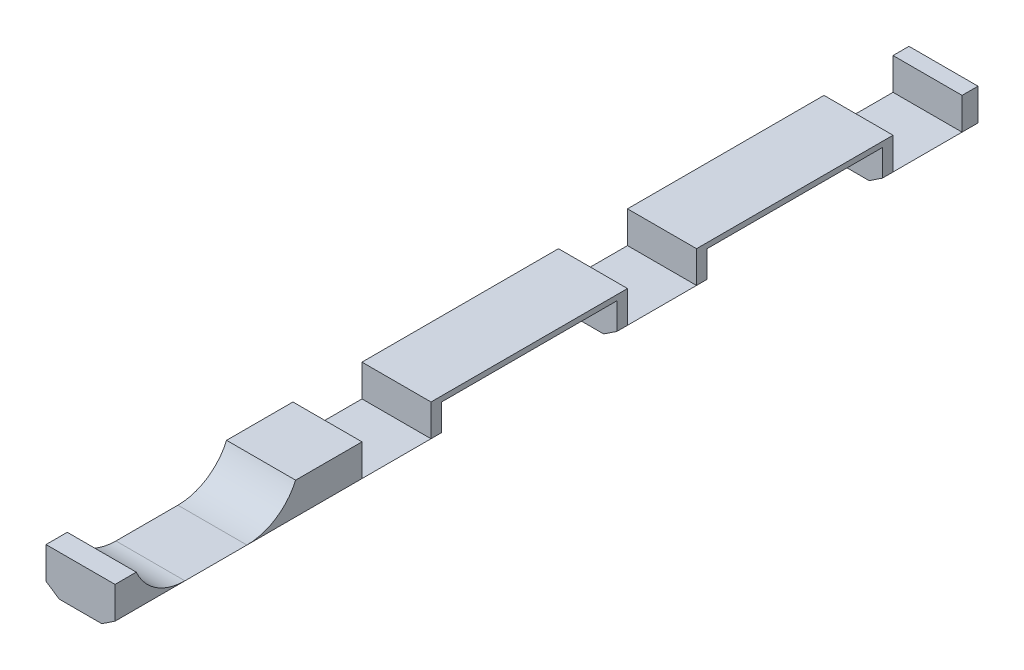
ISO-10303-21;
HEADER;
FILE_DESCRIPTION(('STEP AP214'),'2;1');
FILE_NAME('part.step','',(''),(''),'','','');
FILE_SCHEMA(('AUTOMOTIVE_DESIGN { 1 0 10303 214 1 1 1 1 }'));
ENDSEC;
DATA;
#1=APPLICATION_CONTEXT('core data for automotive mechanical design processes');
#2=APPLICATION_PROTOCOL_DEFINITION('international standard','automotive_design',2000,#1);
#3=PRODUCT_CONTEXT('',#1,'mechanical');
#4=PRODUCT('Part','Part','',(#3));
#5=PRODUCT_RELATED_PRODUCT_CATEGORY('part','',(#4));
#6=PRODUCT_DEFINITION_FORMATION('','',#4);
#7=PRODUCT_DEFINITION_CONTEXT('part definition',#1,'design');
#8=PRODUCT_DEFINITION('design','',#6,#7);
#9=PRODUCT_DEFINITION_SHAPE('','',#8);
#10=(LENGTH_UNIT() NAMED_UNIT(*) SI_UNIT(.MILLI.,.METRE.));
#11=(NAMED_UNIT(*) PLANE_ANGLE_UNIT() SI_UNIT($,.RADIAN.));
#12=(NAMED_UNIT(*) SI_UNIT($,.STERADIAN.) SOLID_ANGLE_UNIT());
#13=UNCERTAINTY_MEASURE_WITH_UNIT(LENGTH_MEASURE(1.E-05),#10,'distance_accuracy_value','');
#14=(GEOMETRIC_REPRESENTATION_CONTEXT(3) GLOBAL_UNCERTAINTY_ASSIGNED_CONTEXT((#13)) GLOBAL_UNIT_ASSIGNED_CONTEXT((#10,
#11,#12)) REPRESENTATION_CONTEXT('',''));
#15=CARTESIAN_POINT('',(0.,0.,0.));
#16=DIRECTION('',(0.,0.,1.));
#17=DIRECTION('',(1.,0.,0.));
#18=AXIS2_PLACEMENT_3D('',#15,#16,#17);
#19=CARTESIAN_POINT('',(-1.,0.663324958071081,65.));
#20=DIRECTION('',(0.552770798392567,0.833333333333333,0.));
#21=DIRECTION('',(-0.833333333333333,0.552770798392567,0.));
#22=AXIS2_PLACEMENT_3D('',#19,#20,#21);
#23=PLANE('',#22);
#24=DIRECTION('',(0.,0.,-1.));
#25=VECTOR('',#24,1.);
#26=CARTESIAN_POINT('',(0.,0.,65.));
#27=LINE('',#26,#25);
#28=CARTESIAN_POINT('',(0.,0.,27.2));
#29=VERTEX_POINT('',#28);
#30=CARTESIAN_POINT('',(0.,0.,20.4));
#31=VERTEX_POINT('',#30);
#32=EDGE_CURVE('E487',#29,#31,#27,.T.);
#33=ORIENTED_EDGE('',*,*,#32,.F.);
#34=DIRECTION('',(-0.833333333333333,0.552770798392567,0.));
#35=VECTOR('',#34,1.);
#36=CARTESIAN_POINT('',(-0.999999999999995,0.663324958071077,27.2));
#37=LINE('',#36,#35);
#38=CARTESIAN_POINT('',(-1.,0.663324958071081,27.2));
#39=VERTEX_POINT('',#38);
#40=EDGE_CURVE('E293',#29,#39,#37,.T.);
#41=ORIENTED_EDGE('',*,*,#40,.T.);
#42=DIRECTION('',(0.,0.,-1.));
#43=VECTOR('',#42,1.);
#44=CARTESIAN_POINT('',(-1.,0.663324958071081,65.));
#45=LINE('',#44,#43);
#46=CARTESIAN_POINT('',(-1.,0.663324958071081,26.4));
#47=VERTEX_POINT('',#46);
#48=EDGE_CURVE('E462',#39,#47,#45,.T.);
#49=ORIENTED_EDGE('',*,*,#48,.T.);
#50=DIRECTION('',(0.,0.,1.));
#51=VECTOR('',#50,1.);
#52=CARTESIAN_POINT('',(-1.,0.663324958071081,21.2));
#53=LINE('',#52,#51);
#54=CARTESIAN_POINT('',(-1.,0.663324958071081,21.2));
#55=VERTEX_POINT('',#54);
#56=EDGE_CURVE('E346',#55,#47,#53,.T.);
#57=ORIENTED_EDGE('',*,*,#56,.F.);
#58=CARTESIAN_POINT('',(-1.,0.663324958071081,20.4));
#59=VERTEX_POINT('',#58);
#60=EDGE_CURVE('E658',#55,#59,#45,.T.);
#61=ORIENTED_EDGE('',*,*,#60,.T.);
#62=DIRECTION('',(0.833333333333333,-0.552770798392567,0.));
#63=VECTOR('',#62,1.);
#64=CARTESIAN_POINT('',(-1.,0.663324958071081,20.4));
#65=LINE('',#64,#63);
#66=EDGE_CURVE('E315',#59,#31,#65,.T.);
#67=ORIENTED_EDGE('',*,*,#66,.T.);
#68=EDGE_LOOP('',(#33,#41,#49,#57,#61,#67));
#69=FACE_BOUND('',#68,.T.);
#70=ADVANCED_FACE('F35',(#69),#23,.F.);
#71=CARTESIAN_POINT('',(0.,0.,65.));
#72=DIRECTION('',(0.,1.,0.));
#73=DIRECTION('',(0.,0.,1.));
#74=AXIS2_PLACEMENT_3D('',#71,#72,#73);
#75=PLANE('',#74);
#76=DIRECTION('',(0.,0.,-1.));
#77=VECTOR('',#76,1.);
#78=CARTESIAN_POINT('',(3.2,0.,65.));
#79=LINE('',#78,#77);
#80=CARTESIAN_POINT('',(3.2,0.,27.2));
#81=VERTEX_POINT('',#80);
#82=CARTESIAN_POINT('',(3.2,0.,20.4));
#83=VERTEX_POINT('',#82);
#84=EDGE_CURVE('E482',#81,#83,#79,.T.);
#85=ORIENTED_EDGE('',*,*,#84,.F.);
#86=DIRECTION('',(-1.,0.,0.));
#87=VECTOR('',#86,1.);
#88=CARTESIAN_POINT('',(0.,0.,27.2));
#89=LINE('',#88,#87);
#90=EDGE_CURVE('E290',#81,#29,#89,.T.);
#91=ORIENTED_EDGE('',*,*,#90,.T.);
#92=ORIENTED_EDGE('',*,*,#32,.T.);
#93=DIRECTION('',(1.,0.,0.));
#94=VECTOR('',#93,1.);
#95=CARTESIAN_POINT('',(0.,0.,20.4));
#96=LINE('',#95,#94);
#97=EDGE_CURVE('E311',#31,#83,#96,.T.);
#98=ORIENTED_EDGE('',*,*,#97,.T.);
#99=EDGE_LOOP('',(#85,#91,#92,#98));
#100=FACE_BOUND('',#99,.T.);
#101=ADVANCED_FACE('F590',(#100),#75,.F.);
#102=CARTESIAN_POINT('',(3.2,0.,65.));
#103=DIRECTION('',(-0.552770798392567,0.833333333333333,0.));
#104=DIRECTION('',(-0.833333333333333,-0.552770798392567,0.));
#105=AXIS2_PLACEMENT_3D('',#102,#103,#104);
#106=PLANE('',#105);
#107=DIRECTION('',(0.,0.,-1.));
#108=VECTOR('',#107,1.);
#109=CARTESIAN_POINT('',(4.2,0.66332495807108,65.));
#110=LINE('',#109,#108);
#111=CARTESIAN_POINT('',(4.2,0.663324958071079,27.2));
#112=VERTEX_POINT('',#111);
#113=CARTESIAN_POINT('',(4.2,0.663324958071081,26.4));
#114=VERTEX_POINT('',#113);
#115=EDGE_CURVE('E477',#112,#114,#110,.T.);
#116=ORIENTED_EDGE('',*,*,#115,.F.);
#117=DIRECTION('',(-0.833333333333333,-0.552770798392567,0.));
#118=VECTOR('',#117,1.);
#119=CARTESIAN_POINT('',(3.2,0.,27.2));
#120=LINE('',#119,#118);
#121=EDGE_CURVE('E11',#112,#81,#120,.T.);
#122=ORIENTED_EDGE('',*,*,#121,.T.);
#123=ORIENTED_EDGE('',*,*,#84,.T.);
#124=DIRECTION('',(0.833333333333333,0.552770798392567,0.));
#125=VECTOR('',#124,1.);
#126=CARTESIAN_POINT('',(3.2,0.,20.4));
#127=LINE('',#126,#125);
#128=CARTESIAN_POINT('',(4.2,0.66332495807108,20.4));
#129=VERTEX_POINT('',#128);
#130=EDGE_CURVE('E503',#83,#129,#127,.T.);
#131=ORIENTED_EDGE('',*,*,#130,.T.);
#132=CARTESIAN_POINT('',(4.2,0.663324958071081,21.2));
#133=VERTEX_POINT('',#132);
#134=EDGE_CURVE('E517',#133,#129,#110,.T.);
#135=ORIENTED_EDGE('',*,*,#134,.F.);
#136=DIRECTION('',(0.,0.,1.));
#137=VECTOR('',#136,1.);
#138=CARTESIAN_POINT('',(4.2,0.663324958071081,65.));
#139=LINE('',#138,#137);
#140=EDGE_CURVE('E389',#133,#114,#139,.T.);
#141=ORIENTED_EDGE('',*,*,#140,.T.);
#142=EDGE_LOOP('',(#116,#122,#123,#131,#135,#141));
#143=FACE_BOUND('',#142,.T.);
#144=ADVANCED_FACE('F585',(#143),#106,.F.);
#145=CARTESIAN_POINT('',(0.,0.,7.19999999999999));
#146=VERTEX_POINT('',#145);
#147=CARTESIAN_POINT('',(0.,0.,0.));
#148=VERTEX_POINT('',#147);
#149=EDGE_CURVE('E481',#146,#148,#27,.T.);
#150=ORIENTED_EDGE('',*,*,#149,.F.);
#151=DIRECTION('',(-0.833333333333333,0.552770798392567,0.));
#152=VECTOR('',#151,1.);
#153=CARTESIAN_POINT('',(-0.999999999999992,0.663324958071076,7.19999999999999));
#154=LINE('',#153,#152);
#155=CARTESIAN_POINT('',(-1.,0.663324958071081,7.19999999999999));
#156=VERTEX_POINT('',#155);
#157=EDGE_CURVE('E322',#146,#156,#154,.T.);
#158=ORIENTED_EDGE('',*,*,#157,.T.);
#159=CARTESIAN_POINT('',(-1.,0.663324958071081,6.39999999999999));
#160=VERTEX_POINT('',#159);
#161=EDGE_CURVE('E604',#156,#160,#45,.T.);
#162=ORIENTED_EDGE('',*,*,#161,.T.);
#163=DIRECTION('',(0.,0.,1.));
#164=VECTOR('',#163,1.);
#165=CARTESIAN_POINT('',(-1.,0.663324958071081,1.2));
#166=LINE('',#165,#164);
#167=CARTESIAN_POINT('',(-1.,0.663324958071081,1.20000000000001));
#168=VERTEX_POINT('',#167);
#169=EDGE_CURVE('E400',#168,#160,#166,.T.);
#170=ORIENTED_EDGE('',*,*,#169,.F.);
#171=CARTESIAN_POINT('',(-1.,0.663324958071081,0.));
#172=VERTEX_POINT('',#171);
#173=EDGE_CURVE('E441',#168,#172,#45,.T.);
#174=ORIENTED_EDGE('',*,*,#173,.T.);
#175=DIRECTION('',(0.833333333333333,-0.552770798392567,0.));
#176=VECTOR('',#175,1.);
#177=CARTESIAN_POINT('',(-1.,0.663324958071081,0.));
#178=LINE('',#177,#176);
#179=EDGE_CURVE('E426',#172,#148,#178,.T.);
#180=ORIENTED_EDGE('',*,*,#179,.T.);
#181=EDGE_LOOP('',(#150,#158,#162,#170,#174,#180));
#182=FACE_BOUND('',#181,.T.);
#183=ADVANCED_FACE('F602',(#182),#23,.F.);
#184=CARTESIAN_POINT('',(3.2,0.,7.19999999999999));
#185=VERTEX_POINT('',#184);
#186=CARTESIAN_POINT('',(3.2,0.,0.));
#187=VERTEX_POINT('',#186);
#188=EDGE_CURVE('E475',#185,#187,#79,.T.);
#189=ORIENTED_EDGE('',*,*,#188,.F.);
#190=DIRECTION('',(-1.,0.,0.));
#191=VECTOR('',#190,1.);
#192=CARTESIAN_POINT('',(0.,0.,7.19999999999999));
#193=LINE('',#192,#191);
#194=EDGE_CURVE('E319',#185,#146,#193,.T.);
#195=ORIENTED_EDGE('',*,*,#194,.T.);
#196=ORIENTED_EDGE('',*,*,#149,.T.);
#197=DIRECTION('',(1.,0.,0.));
#198=VECTOR('',#197,1.);
#199=CARTESIAN_POINT('',(0.,0.,0.));
#200=LINE('',#199,#198);
#201=EDGE_CURVE('E444',#148,#187,#200,.T.);
#202=ORIENTED_EDGE('',*,*,#201,.T.);
#203=EDGE_LOOP('',(#189,#195,#196,#202));
#204=FACE_BOUND('',#203,.T.);
#205=ADVANCED_FACE('F597',(#204),#75,.F.);
#206=CARTESIAN_POINT('',(4.2,0.66332495807108,7.19999999999999));
#207=VERTEX_POINT('',#206);
#208=CARTESIAN_POINT('',(4.2,0.663324958071081,6.39999999999999));
#209=VERTEX_POINT('',#208);
#210=EDGE_CURVE('E518',#207,#209,#110,.T.);
#211=ORIENTED_EDGE('',*,*,#210,.F.);
#212=DIRECTION('',(-0.833333333333333,-0.552770798392567,0.));
#213=VECTOR('',#212,1.);
#214=CARTESIAN_POINT('',(3.19999999999999,0.,7.19999999999999));
#215=LINE('',#214,#213);
#216=EDGE_CURVE('E505',#207,#185,#215,.T.);
#217=ORIENTED_EDGE('',*,*,#216,.T.);
#218=ORIENTED_EDGE('',*,*,#188,.T.);
#219=DIRECTION('',(0.833333333333333,0.552770798392567,0.));
#220=VECTOR('',#219,1.);
#221=CARTESIAN_POINT('',(3.2,0.,0.));
#222=LINE('',#221,#220);
#223=CARTESIAN_POINT('',(4.2,0.66332495807108,0.));
#224=VERTEX_POINT('',#223);
#225=EDGE_CURVE('E447',#187,#224,#222,.T.);
#226=ORIENTED_EDGE('',*,*,#225,.T.);
#227=CARTESIAN_POINT('',(4.2,0.663324958071081,1.2));
#228=VERTEX_POINT('',#227);
#229=EDGE_CURVE('E471',#228,#224,#110,.T.);
#230=ORIENTED_EDGE('',*,*,#229,.F.);
#231=DIRECTION('',(0.,0.,1.));
#232=VECTOR('',#231,1.);
#233=CARTESIAN_POINT('',(4.2,0.663324958071081,65.));
#234=LINE('',#233,#232);
#235=EDGE_CURVE('E409',#228,#209,#234,.T.);
#236=ORIENTED_EDGE('',*,*,#235,.T.);
#237=EDGE_LOOP('',(#211,#217,#218,#226,#230,#236));
#238=FACE_BOUND('',#237,.T.);
#239=ADVANCED_FACE('F537',(#238),#106,.F.);
#240=CARTESIAN_POINT('',(4.2,0.66332495807108,65.));
#241=DIRECTION('',(-1.,0.,0.));
#242=DIRECTION('',(0.,0.,1.));
#243=AXIS2_PLACEMENT_3D('',#240,#241,#242);
#244=PLANE('',#243);
#245=CARTESIAN_POINT('',(4.2,0.66332495807108,65.));
#246=VERTEX_POINT('',#245);
#247=CARTESIAN_POINT('',(4.2,0.66332495807108,59.7339394440353));
#248=VERTEX_POINT('',#247);
#249=EDGE_CURVE('E473',#246,#248,#110,.T.);
#250=ORIENTED_EDGE('',*,*,#249,.T.);
#251=CARTESIAN_POINT('',(4.2,4.66332495807108,59.7339394440353));
#252=DIRECTION('',(-1.,0.,0.));
#253=DIRECTION('',(0.,0.,1.));
#254=AXIS2_PLACEMENT_3D('',#251,#252,#253);
#255=CIRCLE('',#254,4.);
#256=CARTESIAN_POINT('',(4.2,3.06332495807108,63.4));
#257=VERTEX_POINT('',#256);
#258=EDGE_CURVE('E501',#248,#257,#255,.T.);
#259=ORIENTED_EDGE('',*,*,#258,.T.);
#260=DIRECTION('',(0.,0.,-1.));
#261=VECTOR('',#260,1.);
#262=CARTESIAN_POINT('',(4.2,3.06332495807108,65.));
#263=LINE('',#262,#261);
#264=CARTESIAN_POINT('',(4.2,3.06332495807108,65.));
#265=VERTEX_POINT('',#264);
#266=EDGE_CURVE('E468',#265,#257,#263,.T.);
#267=ORIENTED_EDGE('',*,*,#266,.F.);
#268=DIRECTION('',(0.,1.,0.));
#269=VECTOR('',#268,1.);
#270=CARTESIAN_POINT('',(4.2,0.66332495807108,65.));
#271=LINE('',#270,#269);
#272=EDGE_CURVE('E435',#246,#265,#271,.T.);
#273=ORIENTED_EDGE('',*,*,#272,.F.);
#274=EDGE_LOOP('',(#250,#259,#267,#273));
#275=FACE_BOUND('',#274,.T.);
#276=ADVANCED_FACE('F644',(#275),#244,.F.);
#277=CARTESIAN_POINT('',(4.2,3.06332495807108,65.));
#278=DIRECTION('',(0.,-1.,0.));
#279=DIRECTION('',(0.,0.,-1.));
#280=AXIS2_PLACEMENT_3D('',#277,#278,#279);
#281=PLANE('',#280);
#282=ORIENTED_EDGE('',*,*,#266,.T.);
#283=DIRECTION('',(-1.,0.,0.));
#284=VECTOR('',#283,1.);
#285=CARTESIAN_POINT('',(5.,3.06332495807108,63.4));
#286=LINE('',#285,#284);
#287=CARTESIAN_POINT('',(-1.,3.06332495807108,63.4));
#288=VERTEX_POINT('',#287);
#289=EDGE_CURVE('E335',#257,#288,#286,.T.);
#290=ORIENTED_EDGE('',*,*,#289,.T.);
#291=DIRECTION('',(0.,0.,-1.));
#292=VECTOR('',#291,1.);
#293=CARTESIAN_POINT('',(-1.,3.06332495807108,65.));
#294=LINE('',#293,#292);
#295=CARTESIAN_POINT('',(-1.,3.06332495807108,65.));
#296=VERTEX_POINT('',#295);
#297=EDGE_CURVE('E463',#296,#288,#294,.T.);
#298=ORIENTED_EDGE('',*,*,#297,.F.);
#299=DIRECTION('',(-1.,0.,0.));
#300=VECTOR('',#299,1.);
#301=CARTESIAN_POINT('',(4.2,3.06332495807108,65.));
#302=LINE('',#301,#300);
#303=EDGE_CURVE('E437',#265,#296,#302,.T.);
#304=ORIENTED_EDGE('',*,*,#303,.F.);
#305=EDGE_LOOP('',(#282,#290,#298,#304));
#306=FACE_BOUND('',#305,.T.);
#307=ADVANCED_FACE('F788',(#306),#281,.F.);
#308=CARTESIAN_POINT('',(-1.,3.06332495807108,65.));
#309=DIRECTION('',(1.,0.,0.));
#310=DIRECTION('',(0.,1.,0.));
#311=AXIS2_PLACEMENT_3D('',#308,#309,#310);
#312=PLANE('',#311);
#313=ORIENTED_EDGE('',*,*,#297,.T.);
#314=CARTESIAN_POINT('',(-1.,4.66332495807108,59.7339394440353));
#315=DIRECTION('',(1.,0.,0.));
#316=DIRECTION('',(0.,1.,0.));
#317=AXIS2_PLACEMENT_3D('',#314,#315,#316);
#318=CIRCLE('',#317,4.);
#319=CARTESIAN_POINT('',(-1.,0.663324958071082,59.7339394440353));
#320=VERTEX_POINT('',#319);
#321=EDGE_CURVE('E498',#288,#320,#318,.T.);
#322=ORIENTED_EDGE('',*,*,#321,.T.);
#323=CARTESIAN_POINT('',(-1.,0.663324958071081,65.));
#324=VERTEX_POINT('',#323);
#325=EDGE_CURVE('E458',#324,#320,#45,.T.);
#326=ORIENTED_EDGE('',*,*,#325,.F.);
#327=DIRECTION('',(0.,-1.,0.));
#328=VECTOR('',#327,1.);
#329=CARTESIAN_POINT('',(-1.,3.06332495807108,65.));
#330=LINE('',#329,#328);
#331=EDGE_CURVE('E439',#296,#324,#330,.T.);
#332=ORIENTED_EDGE('',*,*,#331,.F.);
#333=EDGE_LOOP('',(#313,#322,#326,#332));
#334=FACE_BOUND('',#333,.T.);
#335=ADVANCED_FACE('F623',(#334),#312,.F.);
#336=DIRECTION('',(0.,0.,-1.));
#337=VECTOR('',#336,1.);
#338=CARTESIAN_POINT('',(4.2,2.66332495807108,65.));
#339=LINE('',#338,#337);
#340=CARTESIAN_POINT('',(4.2,2.66332495807108,20.4));
#341=VERTEX_POINT('',#340);
#342=CARTESIAN_POINT('',(4.2,2.66332495807108,7.19999999999999));
#343=VERTEX_POINT('',#342);
#344=EDGE_CURVE('E328',#341,#343,#339,.T.);
#345=ORIENTED_EDGE('',*,*,#344,.T.);
#346=DIRECTION('',(0.,-1.,0.));
#347=VECTOR('',#346,1.);
#348=CARTESIAN_POINT('',(4.2,0.663324958071064,7.19999999999999));
#349=LINE('',#348,#347);
#350=EDGE_CURVE('E325',#343,#207,#349,.T.);
#351=ORIENTED_EDGE('',*,*,#350,.T.);
#352=ORIENTED_EDGE('',*,*,#210,.T.);
#353=DIRECTION('',(0.,1.,0.));
#354=VECTOR('',#353,1.);
#355=CARTESIAN_POINT('',(4.2,0.66332495807108,6.39999999999999));
#356=LINE('',#355,#354);
#357=CARTESIAN_POINT('',(4.2,3.06332495807108,6.39999999999999));
#358=VERTEX_POINT('',#357);
#359=EDGE_CURVE('E420',#209,#358,#356,.T.);
#360=ORIENTED_EDGE('',*,*,#359,.T.);
#361=CARTESIAN_POINT('',(4.2,3.06332495807108,21.2));
#362=VERTEX_POINT('',#361);
#363=EDGE_CURVE('E575',#362,#358,#263,.T.);
#364=ORIENTED_EDGE('',*,*,#363,.F.);
#365=DIRECTION('',(0.,-1.,0.));
#366=VECTOR('',#365,1.);
#367=CARTESIAN_POINT('',(4.2,0.663324958070949,21.2));
#368=LINE('',#367,#366);
#369=EDGE_CURVE('E395',#362,#133,#368,.T.);
#370=ORIENTED_EDGE('',*,*,#369,.T.);
#371=ORIENTED_EDGE('',*,*,#134,.T.);
#372=DIRECTION('',(0.,1.,0.));
#373=VECTOR('',#372,1.);
#374=CARTESIAN_POINT('',(4.2,0.66332495807108,20.4));
#375=LINE('',#374,#373);
#376=EDGE_CURVE('E58',#129,#341,#375,.T.);
#377=ORIENTED_EDGE('',*,*,#376,.T.);
#378=EDGE_LOOP('',(#345,#351,#352,#360,#364,#370,#371,#377));
#379=FACE_BOUND('',#378,.T.);
#380=ADVANCED_FACE('F524',(#379),#244,.F.);
#381=DIRECTION('',(0.,0.,-1.));
#382=VECTOR('',#381,1.);
#383=CARTESIAN_POINT('',(4.2,2.66332495807108,65.));
#384=LINE('',#383,#382);
#385=CARTESIAN_POINT('',(4.2,2.66332495807108,40.4));
#386=VERTEX_POINT('',#385);
#387=CARTESIAN_POINT('',(4.2,2.66332495807108,27.2));
#388=VERTEX_POINT('',#387);
#389=EDGE_CURVE('E266',#386,#388,#384,.T.);
#390=ORIENTED_EDGE('',*,*,#389,.T.);
#391=DIRECTION('',(0.,-1.,0.));
#392=VECTOR('',#391,1.);
#393=CARTESIAN_POINT('',(4.2,0.663324958071069,27.2));
#394=LINE('',#393,#392);
#395=EDGE_CURVE('E296',#388,#112,#394,.T.);
#396=ORIENTED_EDGE('',*,*,#395,.T.);
#397=ORIENTED_EDGE('',*,*,#115,.T.);
#398=DIRECTION('',(0.,1.,0.));
#399=VECTOR('',#398,1.);
#400=CARTESIAN_POINT('',(4.2,0.66332495807108,26.4));
#401=LINE('',#400,#399);
#402=CARTESIAN_POINT('',(4.2,3.06332495807108,26.4));
#403=VERTEX_POINT('',#402);
#404=EDGE_CURVE('E392',#114,#403,#401,.T.);
#405=ORIENTED_EDGE('',*,*,#404,.T.);
#406=CARTESIAN_POINT('',(4.2,3.06332495807108,41.2));
#407=VERTEX_POINT('',#406);
#408=EDGE_CURVE('E574',#407,#403,#263,.T.);
#409=ORIENTED_EDGE('',*,*,#408,.F.);
#410=DIRECTION('',(0.,-1.,0.));
#411=VECTOR('',#410,1.);
#412=CARTESIAN_POINT('',(4.2,0.663324958071009,41.2));
#413=LINE('',#412,#411);
#414=CARTESIAN_POINT('',(4.2,0.663324958071081,41.2));
#415=VERTEX_POINT('',#414);
#416=EDGE_CURVE('E386',#407,#415,#413,.T.);
#417=ORIENTED_EDGE('',*,*,#416,.T.);
#418=CARTESIAN_POINT('',(4.2,0.66332495807108,40.4));
#419=VERTEX_POINT('',#418);
#420=EDGE_CURVE('E511',#415,#419,#110,.T.);
#421=ORIENTED_EDGE('',*,*,#420,.T.);
#422=DIRECTION('',(0.,1.,0.));
#423=VECTOR('',#422,1.);
#424=CARTESIAN_POINT('',(4.2,0.66332495807108,40.4));
#425=LINE('',#424,#423);
#426=EDGE_CURVE('E50',#419,#386,#425,.T.);
#427=ORIENTED_EDGE('',*,*,#426,.T.);
#428=EDGE_LOOP('',(#390,#396,#397,#405,#409,#417,#421,#427));
#429=FACE_BOUND('',#428,.T.);
#430=ADVANCED_FACE('F515',(#429),#244,.F.);
#431=CARTESIAN_POINT('',(-1.,3.06332495807108,21.2));
#432=VERTEX_POINT('',#431);
#433=CARTESIAN_POINT('',(-1.,3.06332495807108,6.39999999999999));
#434=VERTEX_POINT('',#433);
#435=EDGE_CURVE('E553',#432,#434,#294,.T.);
#436=ORIENTED_EDGE('',*,*,#435,.F.);
#437=DIRECTION('',(-1.,0.,0.));
#438=VECTOR('',#437,1.);
#439=CARTESIAN_POINT('',(5.,3.06332495807108,21.2));
#440=LINE('',#439,#438);
#441=EDGE_CURVE('E353',#362,#432,#440,.T.);
#442=ORIENTED_EDGE('',*,*,#441,.F.);
#443=ORIENTED_EDGE('',*,*,#363,.T.);
#444=DIRECTION('',(-1.,0.,0.));
#445=VECTOR('',#444,1.);
#446=CARTESIAN_POINT('',(5.,3.06332495807108,6.39999999999999));
#447=LINE('',#446,#445);
#448=EDGE_CURVE('E410',#358,#434,#447,.T.);
#449=ORIENTED_EDGE('',*,*,#448,.T.);
#450=EDGE_LOOP('',(#436,#442,#443,#449));
#451=FACE_BOUND('',#450,.T.);
#452=ADVANCED_FACE('F580',(#451),#281,.F.);
#453=ORIENTED_EDGE('',*,*,#408,.T.);
#454=DIRECTION('',(-1.,0.,0.));
#455=VECTOR('',#454,1.);
#456=CARTESIAN_POINT('',(5.,3.06332495807108,26.4));
#457=LINE('',#456,#455);
#458=CARTESIAN_POINT('',(-1.,3.06332495807108,26.4));
#459=VERTEX_POINT('',#458);
#460=EDGE_CURVE('E356',#403,#459,#457,.T.);
#461=ORIENTED_EDGE('',*,*,#460,.T.);
#462=CARTESIAN_POINT('',(-1.,3.06332495807108,41.2));
#463=VERTEX_POINT('',#462);
#464=EDGE_CURVE('E554',#463,#459,#294,.T.);
#465=ORIENTED_EDGE('',*,*,#464,.F.);
#466=DIRECTION('',(-1.,0.,0.));
#467=VECTOR('',#466,1.);
#468=CARTESIAN_POINT('',(5.,3.06332495807108,41.2));
#469=LINE('',#468,#467);
#470=EDGE_CURVE('E347',#407,#463,#469,.T.);
#471=ORIENTED_EDGE('',*,*,#470,.F.);
#472=EDGE_LOOP('',(#453,#461,#465,#471));
#473=FACE_BOUND('',#472,.T.);
#474=ADVANCED_FACE('F619',(#473),#281,.F.);
#475=ORIENTED_EDGE('',*,*,#161,.F.);
#476=DIRECTION('',(0.,-1.,0.));
#477=VECTOR('',#476,1.);
#478=CARTESIAN_POINT('',(-1.,2.66332495807108,7.19999999999999));
#479=LINE('',#478,#477);
#480=CARTESIAN_POINT('',(-1.,2.66332495807108,7.19999999999999));
#481=VERTEX_POINT('',#480);
#482=EDGE_CURVE('E300',#481,#156,#479,.T.);
#483=ORIENTED_EDGE('',*,*,#482,.F.);
#484=DIRECTION('',(0.,0.,-1.));
#485=VECTOR('',#484,1.);
#486=CARTESIAN_POINT('',(-1.,2.66332495807108,7.19999999999999));
#487=LINE('',#486,#485);
#488=CARTESIAN_POINT('',(-1.,2.66332495807108,20.4));
#489=VERTEX_POINT('',#488);
#490=EDGE_CURVE('E305',#489,#481,#487,.T.);
#491=ORIENTED_EDGE('',*,*,#490,.F.);
#492=DIRECTION('',(0.,1.,0.));
#493=VECTOR('',#492,1.);
#494=CARTESIAN_POINT('',(-1.,2.66332495807108,20.4));
#495=LINE('',#494,#493);
#496=EDGE_CURVE('E302',#59,#489,#495,.T.);
#497=ORIENTED_EDGE('',*,*,#496,.F.);
#498=ORIENTED_EDGE('',*,*,#60,.F.);
#499=DIRECTION('',(0.,-1.,0.));
#500=VECTOR('',#499,1.);
#501=CARTESIAN_POINT('',(-1.,3.06332495807108,21.2));
#502=LINE('',#501,#500);
#503=EDGE_CURVE('E344',#432,#55,#502,.T.);
#504=ORIENTED_EDGE('',*,*,#503,.F.);
#505=ORIENTED_EDGE('',*,*,#435,.T.);
#506=DIRECTION('',(0.,1.,0.));
#507=VECTOR('',#506,1.);
#508=CARTESIAN_POINT('',(-1.,3.06332495807108,6.39999999999999));
#509=LINE('',#508,#507);
#510=EDGE_CURVE('E403',#160,#434,#509,.T.);
#511=ORIENTED_EDGE('',*,*,#510,.F.);
#512=EDGE_LOOP('',(#475,#483,#491,#497,#498,#504,#505,#511));
#513=FACE_BOUND('',#512,.T.);
#514=ADVANCED_FACE('F625',(#513),#312,.F.);
#515=ORIENTED_EDGE('',*,*,#48,.F.);
#516=DIRECTION('',(0.,-1.,0.));
#517=VECTOR('',#516,1.);
#518=CARTESIAN_POINT('',(-1.,2.66332495807108,27.2));
#519=LINE('',#518,#517);
#520=CARTESIAN_POINT('',(-1.,2.66332495807108,27.2));
#521=VERTEX_POINT('',#520);
#522=EDGE_CURVE('E277',#521,#39,#519,.T.);
#523=ORIENTED_EDGE('',*,*,#522,.F.);
#524=DIRECTION('',(0.,0.,-1.));
#525=VECTOR('',#524,1.);
#526=CARTESIAN_POINT('',(-1.,2.66332495807108,27.2));
#527=LINE('',#526,#525);
#528=CARTESIAN_POINT('',(-1.,2.66332495807108,40.4));
#529=VERTEX_POINT('',#528);
#530=EDGE_CURVE('E263',#529,#521,#527,.T.);
#531=ORIENTED_EDGE('',*,*,#530,.F.);
#532=DIRECTION('',(0.,1.,0.));
#533=VECTOR('',#532,1.);
#534=CARTESIAN_POINT('',(-1.,2.66332495807108,40.4));
#535=LINE('',#534,#533);
#536=CARTESIAN_POINT('',(-1.,0.663324958071081,40.4));
#537=VERTEX_POINT('',#536);
#538=EDGE_CURVE('E270',#537,#529,#535,.T.);
#539=ORIENTED_EDGE('',*,*,#538,.F.);
#540=CARTESIAN_POINT('',(-1.,0.663324958071081,41.2));
#541=VERTEX_POINT('',#540);
#542=EDGE_CURVE('E605',#541,#537,#45,.T.);
#543=ORIENTED_EDGE('',*,*,#542,.F.);
#544=DIRECTION('',(0.,-1.,0.));
#545=VECTOR('',#544,1.);
#546=CARTESIAN_POINT('',(-1.,3.06332495807108,41.2));
#547=LINE('',#546,#545);
#548=EDGE_CURVE('E343',#463,#541,#547,.T.);
#549=ORIENTED_EDGE('',*,*,#548,.F.);
#550=ORIENTED_EDGE('',*,*,#464,.T.);
#551=DIRECTION('',(0.,1.,0.));
#552=VECTOR('',#551,1.);
#553=CARTESIAN_POINT('',(-1.,3.06332495807108,26.4));
#554=LINE('',#553,#552);
#555=EDGE_CURVE('E350',#47,#459,#554,.T.);
#556=ORIENTED_EDGE('',*,*,#555,.F.);
#557=EDGE_LOOP('',(#515,#523,#531,#539,#543,#549,#550,#556));
#558=FACE_BOUND('',#557,.T.);
#559=ADVANCED_FACE('F280',(#558),#312,.F.);
#560=CARTESIAN_POINT('',(4.2,3.06332495807108,1.19999999999999));
#561=VERTEX_POINT('',#560);
#562=CARTESIAN_POINT('',(4.2,3.06332495807108,0.));
#563=VERTEX_POINT('',#562);
#564=EDGE_CURVE('E466',#561,#563,#263,.T.);
#565=ORIENTED_EDGE('',*,*,#564,.F.);
#566=DIRECTION('',(0.,-1.,0.));
#567=VECTOR('',#566,1.);
#568=CARTESIAN_POINT('',(4.2,0.663324958070889,1.20000000000001));
#569=LINE('',#568,#567);
#570=EDGE_CURVE('E423',#561,#228,#569,.T.);
#571=ORIENTED_EDGE('',*,*,#570,.T.);
#572=ORIENTED_EDGE('',*,*,#229,.T.);
#573=DIRECTION('',(0.,1.,0.));
#574=VECTOR('',#573,1.);
#575=CARTESIAN_POINT('',(4.2,0.66332495807108,0.));
#576=LINE('',#575,#574);
#577=EDGE_CURVE('E450',#224,#563,#576,.T.);
#578=ORIENTED_EDGE('',*,*,#577,.T.);
#579=EDGE_LOOP('',(#565,#571,#572,#578));
#580=FACE_BOUND('',#579,.T.);
#581=ADVANCED_FACE('F542',(#580),#244,.F.);
#582=CARTESIAN_POINT('',(-1.,3.06332495807108,1.19999999999999));
#583=VERTEX_POINT('',#582);
#584=CARTESIAN_POINT('',(-1.,3.06332495807108,0.));
#585=VERTEX_POINT('',#584);
#586=EDGE_CURVE('E460',#583,#585,#294,.T.);
#587=ORIENTED_EDGE('',*,*,#586,.F.);
#588=DIRECTION('',(-1.,0.,0.));
#589=VECTOR('',#588,1.);
#590=CARTESIAN_POINT('',(5.,3.06332495807108,1.19999999999999));
#591=LINE('',#590,#589);
#592=EDGE_CURVE('E407',#561,#583,#591,.T.);
#593=ORIENTED_EDGE('',*,*,#592,.F.);
#594=ORIENTED_EDGE('',*,*,#564,.T.);
#595=DIRECTION('',(-1.,0.,0.));
#596=VECTOR('',#595,1.);
#597=CARTESIAN_POINT('',(4.2,3.06332495807108,0.));
#598=LINE('',#597,#596);
#599=EDGE_CURVE('E453',#563,#585,#598,.T.);
#600=ORIENTED_EDGE('',*,*,#599,.T.);
#601=EDGE_LOOP('',(#587,#593,#594,#600));
#602=FACE_BOUND('',#601,.T.);
#603=ADVANCED_FACE('F550',(#602),#281,.F.);
#604=ORIENTED_EDGE('',*,*,#173,.F.);
#605=DIRECTION('',(0.,-1.,0.));
#606=VECTOR('',#605,1.);
#607=CARTESIAN_POINT('',(-1.,3.06332495807108,1.19999999999999));
#608=LINE('',#607,#606);
#609=EDGE_CURVE('E398',#583,#168,#608,.T.);
#610=ORIENTED_EDGE('',*,*,#609,.F.);
#611=ORIENTED_EDGE('',*,*,#586,.T.);
#612=DIRECTION('',(0.,-1.,0.));
#613=VECTOR('',#612,1.);
#614=CARTESIAN_POINT('',(-1.,3.06332495807108,0.));
#615=LINE('',#614,#613);
#616=EDGE_CURVE('E431',#585,#172,#615,.T.);
#617=ORIENTED_EDGE('',*,*,#616,.T.);
#618=EDGE_LOOP('',(#604,#610,#611,#617));
#619=FACE_BOUND('',#618,.T.);
#620=ADVANCED_FACE('F606',(#619),#312,.F.);
#621=ORIENTED_EDGE('',*,*,#542,.T.);
#622=DIRECTION('',(0.833333333333333,-0.552770798392567,0.));
#623=VECTOR('',#622,1.);
#624=CARTESIAN_POINT('',(-1.,0.663324958071081,40.4));
#625=LINE('',#624,#623);
#626=CARTESIAN_POINT('',(0.,0.,40.4));
#627=VERTEX_POINT('',#626);
#628=EDGE_CURVE('E273',#537,#627,#625,.T.);
#629=ORIENTED_EDGE('',*,*,#628,.T.);
#630=CARTESIAN_POINT('',(0.,0.,65.));
#631=VERTEX_POINT('',#630);
#632=EDGE_CURVE('E483',#631,#627,#27,.T.);
#633=ORIENTED_EDGE('',*,*,#632,.F.);
#634=DIRECTION('',(0.833333333333333,-0.552770798392567,0.));
#635=VECTOR('',#634,1.);
#636=CARTESIAN_POINT('',(-1.,0.663324958071081,65.));
#637=LINE('',#636,#635);
#638=EDGE_CURVE('E427',#324,#631,#637,.T.);
#639=ORIENTED_EDGE('',*,*,#638,.F.);
#640=ORIENTED_EDGE('',*,*,#325,.T.);
#641=DIRECTION('',(0.,0.,1.));
#642=VECTOR('',#641,1.);
#643=CARTESIAN_POINT('',(-1.,0.663324958071081,51.4));
#644=LINE('',#643,#642);
#645=CARTESIAN_POINT('',(-1.,0.663324958071081,55.0660605559647));
#646=VERTEX_POINT('',#645);
#647=EDGE_CURVE('E331',#646,#320,#644,.T.);
#648=ORIENTED_EDGE('',*,*,#647,.F.);
#649=CARTESIAN_POINT('',(-1.,0.663324958071081,46.4));
#650=VERTEX_POINT('',#649);
#651=EDGE_CURVE('E461',#646,#650,#45,.T.);
#652=ORIENTED_EDGE('',*,*,#651,.T.);
#653=DIRECTION('',(0.,0.,1.));
#654=VECTOR('',#653,1.);
#655=CARTESIAN_POINT('',(-1.,0.663324958071081,41.2));
#656=LINE('',#655,#654);
#657=EDGE_CURVE('E365',#541,#650,#656,.T.);
#658=ORIENTED_EDGE('',*,*,#657,.F.);
#659=EDGE_LOOP('',(#621,#629,#633,#639,#640,#648,#652,#658));
#660=FACE_BOUND('',#659,.T.);
#661=ADVANCED_FACE('F608',(#660),#23,.F.);
#662=ORIENTED_EDGE('',*,*,#632,.T.);
#663=DIRECTION('',(1.,0.,0.));
#664=VECTOR('',#663,1.);
#665=CARTESIAN_POINT('',(0.,0.,40.4));
#666=LINE('',#665,#664);
#667=CARTESIAN_POINT('',(3.2,0.,40.4));
#668=VERTEX_POINT('',#667);
#669=EDGE_CURVE('E284',#627,#668,#666,.T.);
#670=ORIENTED_EDGE('',*,*,#669,.T.);
#671=CARTESIAN_POINT('',(3.2,0.,65.));
#672=VERTEX_POINT('',#671);
#673=EDGE_CURVE('E478',#672,#668,#79,.T.);
#674=ORIENTED_EDGE('',*,*,#673,.F.);
#675=DIRECTION('',(1.,0.,0.));
#676=VECTOR('',#675,1.);
#677=CARTESIAN_POINT('',(0.,0.,65.));
#678=LINE('',#677,#676);
#679=EDGE_CURVE('E430',#631,#672,#678,.T.);
#680=ORIENTED_EDGE('',*,*,#679,.F.);
#681=EDGE_LOOP('',(#662,#670,#674,#680));
#682=FACE_BOUND('',#681,.T.);
#683=ADVANCED_FACE('F615',(#682),#75,.F.);
#684=ORIENTED_EDGE('',*,*,#673,.T.);
#685=DIRECTION('',(0.833333333333333,0.552770798392567,0.));
#686=VECTOR('',#685,1.);
#687=CARTESIAN_POINT('',(3.2,0.,40.4));
#688=LINE('',#687,#686);
#689=EDGE_CURVE('E43',#668,#419,#688,.T.);
#690=ORIENTED_EDGE('',*,*,#689,.T.);
#691=ORIENTED_EDGE('',*,*,#420,.F.);
#692=DIRECTION('',(0.,0.,1.));
#693=VECTOR('',#692,1.);
#694=CARTESIAN_POINT('',(4.2,0.663324958071081,65.));
#695=LINE('',#694,#693);
#696=CARTESIAN_POINT('',(4.2,0.663324958071081,46.4));
#697=VERTEX_POINT('',#696);
#698=EDGE_CURVE('E355',#415,#697,#695,.T.);
#699=ORIENTED_EDGE('',*,*,#698,.T.);
#700=CARTESIAN_POINT('',(4.2,0.663324958071082,55.0660605559647));
#701=VERTEX_POINT('',#700);
#702=EDGE_CURVE('E476',#701,#697,#110,.T.);
#703=ORIENTED_EDGE('',*,*,#702,.F.);
#704=DIRECTION('',(0.,0.,1.));
#705=VECTOR('',#704,1.);
#706=CARTESIAN_POINT('',(4.2,0.663324958071083,65.));
#707=LINE('',#706,#705);
#708=EDGE_CURVE('E338',#701,#248,#707,.T.);
#709=ORIENTED_EDGE('',*,*,#708,.T.);
#710=ORIENTED_EDGE('',*,*,#249,.F.);
#711=DIRECTION('',(0.833333333333333,0.552770798392567,0.));
#712=VECTOR('',#711,1.);
#713=CARTESIAN_POINT('',(3.2,0.,65.));
#714=LINE('',#713,#712);
#715=EDGE_CURVE('E433',#672,#246,#714,.T.);
#716=ORIENTED_EDGE('',*,*,#715,.F.);
#717=EDGE_LOOP('',(#684,#690,#691,#699,#703,#709,#710,#716));
#718=FACE_BOUND('',#717,.T.);
#719=ADVANCED_FACE('F510',(#718),#106,.F.);
#720=CARTESIAN_POINT('',(4.2,3.06332495807108,51.4));
#721=VERTEX_POINT('',#720);
#722=CARTESIAN_POINT('',(4.2,3.06332495807108,46.4));
#723=VERTEX_POINT('',#722);
#724=EDGE_CURVE('E472',#721,#723,#263,.T.);
#725=ORIENTED_EDGE('',*,*,#724,.F.);
#726=CARTESIAN_POINT('',(4.2,4.66332495807108,55.0660605559647));
#727=DIRECTION('',(-1.,0.,0.));
#728=DIRECTION('',(0.,0.,1.));
#729=AXIS2_PLACEMENT_3D('',#726,#727,#728);
#730=CIRCLE('',#729,4.);
#731=EDGE_CURVE('E492',#721,#701,#730,.T.);
#732=ORIENTED_EDGE('',*,*,#731,.T.);
#733=ORIENTED_EDGE('',*,*,#702,.T.);
#734=DIRECTION('',(0.,1.,0.));
#735=VECTOR('',#734,1.);
#736=CARTESIAN_POINT('',(4.2,0.66332495807108,46.4));
#737=LINE('',#736,#735);
#738=EDGE_CURVE('E383',#697,#723,#737,.T.);
#739=ORIENTED_EDGE('',*,*,#738,.T.);
#740=EDGE_LOOP('',(#725,#732,#733,#739));
#741=FACE_BOUND('',#740,.T.);
#742=ADVANCED_FACE('F646',(#741),#244,.F.);
#743=CARTESIAN_POINT('',(-1.,3.06332495807108,51.4));
#744=VERTEX_POINT('',#743);
#745=CARTESIAN_POINT('',(-1.,3.06332495807108,46.4));
#746=VERTEX_POINT('',#745);
#747=EDGE_CURVE('E467',#744,#746,#294,.T.);
#748=ORIENTED_EDGE('',*,*,#747,.F.);
#749=DIRECTION('',(-1.,0.,0.));
#750=VECTOR('',#749,1.);
#751=CARTESIAN_POINT('',(5.,3.06332495807108,51.4));
#752=LINE('',#751,#750);
#753=EDGE_CURVE('E334',#721,#744,#752,.T.);
#754=ORIENTED_EDGE('',*,*,#753,.F.);
#755=ORIENTED_EDGE('',*,*,#724,.T.);
#756=DIRECTION('',(-1.,0.,0.));
#757=VECTOR('',#756,1.);
#758=CARTESIAN_POINT('',(5.,3.06332495807108,46.4));
#759=LINE('',#758,#757);
#760=EDGE_CURVE('E373',#723,#746,#759,.T.);
#761=ORIENTED_EDGE('',*,*,#760,.T.);
#762=EDGE_LOOP('',(#748,#754,#755,#761));
#763=FACE_BOUND('',#762,.T.);
#764=ADVANCED_FACE('F570',(#763),#281,.F.);
#765=ORIENTED_EDGE('',*,*,#651,.F.);
#766=CARTESIAN_POINT('',(-1.,4.66332495807108,55.0660605559647));
#767=DIRECTION('',(1.,0.,0.));
#768=DIRECTION('',(0.,1.,0.));
#769=AXIS2_PLACEMENT_3D('',#766,#767,#768);
#770=CIRCLE('',#769,4.);
#771=EDGE_CURVE('E490',#646,#744,#770,.T.);
#772=ORIENTED_EDGE('',*,*,#771,.T.);
#773=ORIENTED_EDGE('',*,*,#747,.T.);
#774=DIRECTION('',(0.,1.,0.));
#775=VECTOR('',#774,1.);
#776=CARTESIAN_POINT('',(-1.,3.06332495807108,46.4));
#777=LINE('',#776,#775);
#778=EDGE_CURVE('E368',#650,#746,#777,.T.);
#779=ORIENTED_EDGE('',*,*,#778,.F.);
#780=EDGE_LOOP('',(#765,#772,#773,#779));
#781=FACE_BOUND('',#780,.T.);
#782=ADVANCED_FACE('F562',(#781),#312,.F.);
#783=CARTESIAN_POINT('',(0.,0.,65.));
#784=DIRECTION('',(0.,0.,1.));
#785=DIRECTION('',(1.,0.,0.));
#786=AXIS2_PLACEMENT_3D('',#783,#784,#785);
#787=PLANE('',#786);
#788=ORIENTED_EDGE('',*,*,#638,.T.);
#789=ORIENTED_EDGE('',*,*,#679,.T.);
#790=ORIENTED_EDGE('',*,*,#715,.T.);
#791=ORIENTED_EDGE('',*,*,#272,.T.);
#792=ORIENTED_EDGE('',*,*,#303,.T.);
#793=ORIENTED_EDGE('',*,*,#331,.T.);
#794=EDGE_LOOP('',(#788,#789,#790,#791,#792,#793));
#795=FACE_BOUND('',#794,.T.);
#796=ADVANCED_FACE('F622',(#795),#787,.T.);
#797=CARTESIAN_POINT('',(0.,0.,0.));
#798=DIRECTION('',(0.,0.,1.));
#799=DIRECTION('',(1.,0.,0.));
#800=AXIS2_PLACEMENT_3D('',#797,#798,#799);
#801=PLANE('',#800);
#802=ORIENTED_EDGE('',*,*,#179,.F.);
#803=ORIENTED_EDGE('',*,*,#616,.F.);
#804=ORIENTED_EDGE('',*,*,#599,.F.);
#805=ORIENTED_EDGE('',*,*,#577,.F.);
#806=ORIENTED_EDGE('',*,*,#225,.F.);
#807=ORIENTED_EDGE('',*,*,#201,.F.);
#808=EDGE_LOOP('',(#802,#803,#804,#805,#806,#807));
#809=FACE_BOUND('',#808,.T.);
#810=ADVANCED_FACE('F601',(#809),#801,.F.);
#811=CARTESIAN_POINT('',(5.,3.06332495807108,1.19999999999999));
#812=DIRECTION('',(0.,0.,-1.));
#813=DIRECTION('',(0.,1.,0.));
#814=AXIS2_PLACEMENT_3D('',#811,#812,#813);
#815=PLANE('',#814);
#816=ORIENTED_EDGE('',*,*,#592,.T.);
#817=ORIENTED_EDGE('',*,*,#609,.T.);
#818=DIRECTION('',(-1.,0.,0.));
#819=VECTOR('',#818,1.);
#820=CARTESIAN_POINT('',(5.,0.663324958071082,1.2));
#821=LINE('',#820,#819);
#822=EDGE_CURVE('E406',#228,#168,#821,.T.);
#823=ORIENTED_EDGE('',*,*,#822,.F.);
#824=ORIENTED_EDGE('',*,*,#570,.F.);
#825=EDGE_LOOP('',(#816,#817,#823,#824));
#826=FACE_BOUND('',#825,.T.);
#827=ADVANCED_FACE('F546',(#826),#815,.F.);
#828=CARTESIAN_POINT('',(5.,3.06332495807108,6.39999999999999));
#829=DIRECTION('',(0.,0.,1.));
#830=DIRECTION('',(1.,0.,0.));
#831=AXIS2_PLACEMENT_3D('',#828,#829,#830);
#832=PLANE('',#831);
#833=DIRECTION('',(-1.,0.,0.));
#834=VECTOR('',#833,1.);
#835=CARTESIAN_POINT('',(5.,0.663324958071082,6.39999999999999));
#836=LINE('',#835,#834);
#837=EDGE_CURVE('E413',#209,#160,#836,.T.);
#838=ORIENTED_EDGE('',*,*,#837,.T.);
#839=ORIENTED_EDGE('',*,*,#510,.T.);
#840=ORIENTED_EDGE('',*,*,#448,.F.);
#841=ORIENTED_EDGE('',*,*,#359,.F.);
#842=EDGE_LOOP('',(#838,#839,#840,#841));
#843=FACE_BOUND('',#842,.T.);
#844=ADVANCED_FACE('F530',(#843),#832,.F.);
#845=CARTESIAN_POINT('',(5.,0.663324958071082,1.2));
#846=DIRECTION('',(0.,-1.,0.));
#847=DIRECTION('',(1.,0.,0.));
#848=AXIS2_PLACEMENT_3D('',#845,#846,#847);
#849=PLANE('',#848);
#850=ORIENTED_EDGE('',*,*,#822,.T.);
#851=ORIENTED_EDGE('',*,*,#169,.T.);
#852=ORIENTED_EDGE('',*,*,#837,.F.);
#853=ORIENTED_EDGE('',*,*,#235,.F.);
#854=EDGE_LOOP('',(#850,#851,#852,#853));
#855=FACE_BOUND('',#854,.T.);
#856=ADVANCED_FACE('F532',(#855),#849,.F.);
#857=CARTESIAN_POINT('',(5.,3.06332495807108,41.2));
#858=DIRECTION('',(0.,0.,-1.));
#859=DIRECTION('',(0.,1.,0.));
#860=AXIS2_PLACEMENT_3D('',#857,#858,#859);
#861=PLANE('',#860);
#862=ORIENTED_EDGE('',*,*,#470,.T.);
#863=ORIENTED_EDGE('',*,*,#548,.T.);
#864=DIRECTION('',(-1.,0.,0.));
#865=VECTOR('',#864,1.);
#866=CARTESIAN_POINT('',(5.,0.663324958071082,41.2));
#867=LINE('',#866,#865);
#868=EDGE_CURVE('E371',#415,#541,#867,.T.);
#869=ORIENTED_EDGE('',*,*,#868,.F.);
#870=ORIENTED_EDGE('',*,*,#416,.F.);
#871=EDGE_LOOP('',(#862,#863,#869,#870));
#872=FACE_BOUND('',#871,.T.);
#873=ADVANCED_FACE('F678',(#872),#861,.F.);
#874=CARTESIAN_POINT('',(5.,3.06332495807108,46.4));
#875=DIRECTION('',(0.,0.,1.));
#876=DIRECTION('',(1.,0.,0.));
#877=AXIS2_PLACEMENT_3D('',#874,#875,#876);
#878=PLANE('',#877);
#879=DIRECTION('',(-1.,0.,0.));
#880=VECTOR('',#879,1.);
#881=CARTESIAN_POINT('',(5.,0.663324958071082,46.4));
#882=LINE('',#881,#880);
#883=EDGE_CURVE('E376',#697,#650,#882,.T.);
#884=ORIENTED_EDGE('',*,*,#883,.T.);
#885=ORIENTED_EDGE('',*,*,#778,.T.);
#886=ORIENTED_EDGE('',*,*,#760,.F.);
#887=ORIENTED_EDGE('',*,*,#738,.F.);
#888=EDGE_LOOP('',(#884,#885,#886,#887));
#889=FACE_BOUND('',#888,.T.);
#890=ADVANCED_FACE('F567',(#889),#878,.F.);
#891=CARTESIAN_POINT('',(5.,0.663324958071082,41.2));
#892=DIRECTION('',(0.,-1.,0.));
#893=DIRECTION('',(1.,0.,0.));
#894=AXIS2_PLACEMENT_3D('',#891,#892,#893);
#895=PLANE('',#894);
#896=ORIENTED_EDGE('',*,*,#868,.T.);
#897=ORIENTED_EDGE('',*,*,#657,.T.);
#898=ORIENTED_EDGE('',*,*,#883,.F.);
#899=ORIENTED_EDGE('',*,*,#698,.F.);
#900=EDGE_LOOP('',(#896,#897,#898,#899));
#901=FACE_BOUND('',#900,.T.);
#902=ADVANCED_FACE('F681',(#901),#895,.F.);
#903=CARTESIAN_POINT('',(5.,3.06332495807108,21.2));
#904=DIRECTION('',(0.,0.,-1.));
#905=DIRECTION('',(0.,1.,0.));
#906=AXIS2_PLACEMENT_3D('',#903,#904,#905);
#907=PLANE('',#906);
#908=ORIENTED_EDGE('',*,*,#441,.T.);
#909=ORIENTED_EDGE('',*,*,#503,.T.);
#910=DIRECTION('',(-1.,0.,0.));
#911=VECTOR('',#910,1.);
#912=CARTESIAN_POINT('',(5.,0.663324958071082,21.2));
#913=LINE('',#912,#911);
#914=EDGE_CURVE('E352',#133,#55,#913,.T.);
#915=ORIENTED_EDGE('',*,*,#914,.F.);
#916=ORIENTED_EDGE('',*,*,#369,.F.);
#917=EDGE_LOOP('',(#908,#909,#915,#916));
#918=FACE_BOUND('',#917,.T.);
#919=ADVANCED_FACE('F668',(#918),#907,.F.);
#920=CARTESIAN_POINT('',(5.,3.06332495807108,26.4));
#921=DIRECTION('',(0.,0.,1.));
#922=DIRECTION('',(1.,0.,0.));
#923=AXIS2_PLACEMENT_3D('',#920,#921,#922);
#924=PLANE('',#923);
#925=DIRECTION('',(-1.,0.,0.));
#926=VECTOR('',#925,1.);
#927=CARTESIAN_POINT('',(5.,0.663324958071082,26.4));
#928=LINE('',#927,#926);
#929=EDGE_CURVE('E359',#114,#47,#928,.T.);
#930=ORIENTED_EDGE('',*,*,#929,.T.);
#931=ORIENTED_EDGE('',*,*,#555,.T.);
#932=ORIENTED_EDGE('',*,*,#460,.F.);
#933=ORIENTED_EDGE('',*,*,#404,.F.);
#934=EDGE_LOOP('',(#930,#931,#932,#933));
#935=FACE_BOUND('',#934,.T.);
#936=ADVANCED_FACE('F674',(#935),#924,.F.);
#937=CARTESIAN_POINT('',(5.,0.663324958071082,21.2));
#938=DIRECTION('',(0.,-1.,0.));
#939=DIRECTION('',(1.,0.,0.));
#940=AXIS2_PLACEMENT_3D('',#937,#938,#939);
#941=PLANE('',#940);
#942=ORIENTED_EDGE('',*,*,#914,.T.);
#943=ORIENTED_EDGE('',*,*,#56,.T.);
#944=ORIENTED_EDGE('',*,*,#929,.F.);
#945=ORIENTED_EDGE('',*,*,#140,.F.);
#946=EDGE_LOOP('',(#942,#943,#944,#945));
#947=FACE_BOUND('',#946,.T.);
#948=ADVANCED_FACE('F670',(#947),#941,.F.);
#949=CARTESIAN_POINT('',(5.,0.663324958071082,51.4));
#950=DIRECTION('',(0.,-1.,0.));
#951=DIRECTION('',(1.,0.,0.));
#952=AXIS2_PLACEMENT_3D('',#949,#950,#951);
#953=PLANE('',#952);
#954=ORIENTED_EDGE('',*,*,#647,.T.);
#955=DIRECTION('',(1.,0.,0.));
#956=VECTOR('',#955,1.);
#957=CARTESIAN_POINT('',(5.,0.663324958071083,59.7339394440353));
#958=LINE('',#957,#956);
#959=EDGE_CURVE('E495',#320,#248,#958,.T.);
#960=ORIENTED_EDGE('',*,*,#959,.T.);
#961=ORIENTED_EDGE('',*,*,#708,.F.);
#962=DIRECTION('',(-1.,0.,0.));
#963=VECTOR('',#962,1.);
#964=CARTESIAN_POINT('',(5.,0.663324958071082,55.0660605559647));
#965=LINE('',#964,#963);
#966=EDGE_CURVE('E486',#701,#646,#965,.T.);
#967=ORIENTED_EDGE('',*,*,#966,.T.);
#968=EDGE_LOOP('',(#954,#960,#961,#967));
#969=FACE_BOUND('',#968,.T.);
#970=ADVANCED_FACE('F686',(#969),#953,.F.);
#971=CARTESIAN_POINT('',(5.,4.66332495807108,55.0660605559647));
#972=DIRECTION('',(-1.,0.,0.));
#973=DIRECTION('',(0.,0.,1.));
#974=AXIS2_PLACEMENT_3D('',#971,#972,#973);
#975=CYLINDRICAL_SURFACE('',#974,4.);
#976=ORIENTED_EDGE('',*,*,#731,.F.);
#977=ORIENTED_EDGE('',*,*,#753,.T.);
#978=ORIENTED_EDGE('',*,*,#771,.F.);
#979=ORIENTED_EDGE('',*,*,#966,.F.);
#980=EDGE_LOOP('',(#976,#977,#978,#979));
#981=FACE_BOUND('',#980,.T.);
#982=ADVANCED_FACE('F691',(#981),#975,.F.);
#983=CARTESIAN_POINT('',(5.,4.66332495807108,59.7339394440353));
#984=DIRECTION('',(1.,0.,0.));
#985=DIRECTION('',(0.,0.,-1.));
#986=AXIS2_PLACEMENT_3D('',#983,#984,#985);
#987=CYLINDRICAL_SURFACE('',#986,4.);
#988=ORIENTED_EDGE('',*,*,#258,.F.);
#989=ORIENTED_EDGE('',*,*,#959,.F.);
#990=ORIENTED_EDGE('',*,*,#321,.F.);
#991=ORIENTED_EDGE('',*,*,#289,.F.);
#992=EDGE_LOOP('',(#988,#989,#990,#991));
#993=FACE_BOUND('',#992,.T.);
#994=ADVANCED_FACE('F37',(#993),#987,.F.);
#995=CARTESIAN_POINT('',(9.,2.66332495807108,7.19999999999999));
#996=DIRECTION('',(0.,1.,0.));
#997=DIRECTION('',(-1.,0.,0.));
#998=AXIS2_PLACEMENT_3D('',#995,#996,#997);
#999=PLANE('',#998);
#1000=DIRECTION('',(-1.,0.,0.));
#1001=VECTOR('',#1000,1.);
#1002=CARTESIAN_POINT('',(9.,2.66332495807108,20.4));
#1003=LINE('',#1002,#1001);
#1004=EDGE_CURVE('E308',#341,#489,#1003,.T.);
#1005=ORIENTED_EDGE('',*,*,#1004,.T.);
#1006=ORIENTED_EDGE('',*,*,#490,.T.);
#1007=DIRECTION('',(-1.,0.,0.));
#1008=VECTOR('',#1007,1.);
#1009=CARTESIAN_POINT('',(9.,2.66332495807108,7.19999999999999));
#1010=LINE('',#1009,#1008);
#1011=EDGE_CURVE('E309',#343,#481,#1010,.T.);
#1012=ORIENTED_EDGE('',*,*,#1011,.F.);
#1013=ORIENTED_EDGE('',*,*,#344,.F.);
#1014=EDGE_LOOP('',(#1005,#1006,#1012,#1013));
#1015=FACE_BOUND('',#1014,.T.);
#1016=ADVANCED_FACE('F697',(#1015),#999,.F.);
#1017=CARTESIAN_POINT('',(9.,2.66332495807108,7.19999999999999));
#1018=DIRECTION('',(0.,0.,-1.));
#1019=DIRECTION('',(0.,1.,0.));
#1020=AXIS2_PLACEMENT_3D('',#1017,#1018,#1019);
#1021=PLANE('',#1020);
#1022=ORIENTED_EDGE('',*,*,#1011,.T.);
#1023=ORIENTED_EDGE('',*,*,#482,.T.);
#1024=ORIENTED_EDGE('',*,*,#157,.F.);
#1025=ORIENTED_EDGE('',*,*,#194,.F.);
#1026=ORIENTED_EDGE('',*,*,#216,.F.);
#1027=ORIENTED_EDGE('',*,*,#350,.F.);
#1028=EDGE_LOOP('',(#1022,#1023,#1024,#1025,#1026,#1027));
#1029=FACE_BOUND('',#1028,.T.);
#1030=ADVANCED_FACE('F706',(#1029),#1021,.F.);
#1031=CARTESIAN_POINT('',(9.,2.66332495807108,20.4));
#1032=DIRECTION('',(0.,0.,1.));
#1033=DIRECTION('',(1.,0.,0.));
#1034=AXIS2_PLACEMENT_3D('',#1031,#1032,#1033);
#1035=PLANE('',#1034);
#1036=ORIENTED_EDGE('',*,*,#130,.F.);
#1037=ORIENTED_EDGE('',*,*,#97,.F.);
#1038=ORIENTED_EDGE('',*,*,#66,.F.);
#1039=ORIENTED_EDGE('',*,*,#496,.T.);
#1040=ORIENTED_EDGE('',*,*,#1004,.F.);
#1041=ORIENTED_EDGE('',*,*,#376,.F.);
#1042=EDGE_LOOP('',(#1036,#1037,#1038,#1039,#1040,#1041));
#1043=FACE_BOUND('',#1042,.T.);
#1044=ADVANCED_FACE('F588',(#1043),#1035,.F.);
#1045=CARTESIAN_POINT('',(9.,2.66332495807108,27.2));
#1046=DIRECTION('',(0.,1.,0.));
#1047=DIRECTION('',(-1.,0.,0.));
#1048=AXIS2_PLACEMENT_3D('',#1045,#1046,#1047);
#1049=PLANE('',#1048);
#1050=DIRECTION('',(-1.,0.,0.));
#1051=VECTOR('',#1050,1.);
#1052=CARTESIAN_POINT('',(9.,2.66332495807108,40.4));
#1053=LINE('',#1052,#1051);
#1054=EDGE_CURVE('E258',#386,#529,#1053,.T.);
#1055=ORIENTED_EDGE('',*,*,#1054,.T.);
#1056=ORIENTED_EDGE('',*,*,#530,.T.);
#1057=DIRECTION('',(-1.,0.,0.));
#1058=VECTOR('',#1057,1.);
#1059=CARTESIAN_POINT('',(9.,2.66332495807108,27.2));
#1060=LINE('',#1059,#1058);
#1061=EDGE_CURVE('E267',#388,#521,#1060,.T.);
#1062=ORIENTED_EDGE('',*,*,#1061,.F.);
#1063=ORIENTED_EDGE('',*,*,#389,.F.);
#1064=EDGE_LOOP('',(#1055,#1056,#1062,#1063));
#1065=FACE_BOUND('',#1064,.T.);
#1066=ADVANCED_FACE('F260',(#1065),#1049,.F.);
#1067=CARTESIAN_POINT('',(9.,2.66332495807108,27.2));
#1068=DIRECTION('',(0.,0.,-1.));
#1069=DIRECTION('',(0.,1.,0.));
#1070=AXIS2_PLACEMENT_3D('',#1067,#1068,#1069);
#1071=PLANE('',#1070);
#1072=ORIENTED_EDGE('',*,*,#1061,.T.);
#1073=ORIENTED_EDGE('',*,*,#522,.T.);
#1074=ORIENTED_EDGE('',*,*,#40,.F.);
#1075=ORIENTED_EDGE('',*,*,#90,.F.);
#1076=ORIENTED_EDGE('',*,*,#121,.F.);
#1077=ORIENTED_EDGE('',*,*,#395,.F.);
#1078=EDGE_LOOP('',(#1072,#1073,#1074,#1075,#1076,#1077));
#1079=FACE_BOUND('',#1078,.T.);
#1080=ADVANCED_FACE('F884',(#1079),#1071,.F.);
#1081=CARTESIAN_POINT('',(9.,2.66332495807108,40.4));
#1082=DIRECTION('',(0.,0.,1.));
#1083=DIRECTION('',(1.,0.,0.));
#1084=AXIS2_PLACEMENT_3D('',#1081,#1082,#1083);
#1085=PLANE('',#1084);
#1086=ORIENTED_EDGE('',*,*,#689,.F.);
#1087=ORIENTED_EDGE('',*,*,#669,.F.);
#1088=ORIENTED_EDGE('',*,*,#628,.F.);
#1089=ORIENTED_EDGE('',*,*,#538,.T.);
#1090=ORIENTED_EDGE('',*,*,#1054,.F.);
#1091=ORIENTED_EDGE('',*,*,#426,.F.);
#1092=EDGE_LOOP('',(#1086,#1087,#1088,#1089,#1090,#1091));
#1093=FACE_BOUND('',#1092,.T.);
#1094=ADVANCED_FACE('F271',(#1093),#1085,.F.);
#1095=CLOSED_SHELL('',(#70,#101,#144,#183,#205,#239,#276,#307,#335,#380,#430,#452,#474,#514,
#559,#581,#603,#620,#661,#683,#719,#742,#764,#782,#796,#810,#827,#844,#856,#873,#890,#902,#919,
#936,#948,#970,#982,#994,#1016,#1030,#1044,#1066,#1080,#1094));
#1096=MANIFOLD_SOLID_BREP('B2',#1095);
#1097=ADVANCED_BREP_SHAPE_REPRESENTATION('',(#18,#1096),#14);
#1098=SHAPE_DEFINITION_REPRESENTATION(#9,#1097);
ENDSEC;
END-ISO-10303-21;
